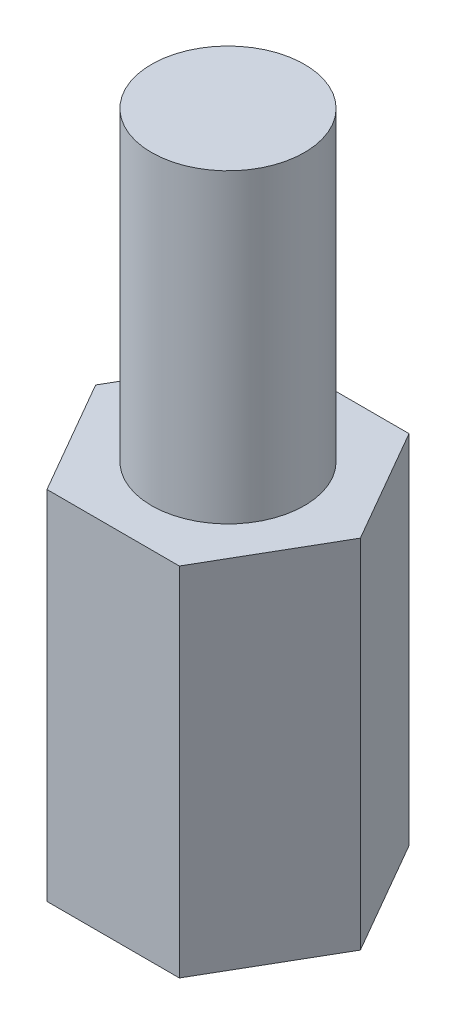
ISO-10303-21;
HEADER;
FILE_DESCRIPTION(('STEP AP214'),'2;1');
FILE_NAME('part.step','',(''),(''),'','','');
FILE_SCHEMA(('AUTOMOTIVE_DESIGN { 1 0 10303 214 1 1 1 1 }'));
ENDSEC;
DATA;
#1=APPLICATION_CONTEXT('core data for automotive mechanical design processes');
#2=APPLICATION_PROTOCOL_DEFINITION('international standard','automotive_design',2000,#1);
#3=PRODUCT_CONTEXT('',#1,'mechanical');
#4=PRODUCT('Part','Part','',(#3));
#5=PRODUCT_RELATED_PRODUCT_CATEGORY('part','',(#4));
#6=PRODUCT_DEFINITION_FORMATION('','',#4);
#7=PRODUCT_DEFINITION_CONTEXT('part definition',#1,'design');
#8=PRODUCT_DEFINITION('design','',#6,#7);
#9=PRODUCT_DEFINITION_SHAPE('','',#8);
#10=(LENGTH_UNIT() NAMED_UNIT(*) SI_UNIT(.MILLI.,.METRE.));
#11=(NAMED_UNIT(*) PLANE_ANGLE_UNIT() SI_UNIT($,.RADIAN.));
#12=(NAMED_UNIT(*) SI_UNIT($,.STERADIAN.) SOLID_ANGLE_UNIT());
#13=UNCERTAINTY_MEASURE_WITH_UNIT(LENGTH_MEASURE(1.E-05),#10,'distance_accuracy_value','');
#14=(GEOMETRIC_REPRESENTATION_CONTEXT(3) GLOBAL_UNCERTAINTY_ASSIGNED_CONTEXT((#13)) GLOBAL_UNIT_ASSIGNED_CONTEXT((#10,
#11,#12)) REPRESENTATION_CONTEXT('',''));
#15=CARTESIAN_POINT('',(0.,0.,0.));
#16=DIRECTION('',(0.,0.,1.));
#17=DIRECTION('',(1.,0.,0.));
#18=AXIS2_PLACEMENT_3D('',#15,#16,#17);
#19=CARTESIAN_POINT('',(0.,13.,0.));
#20=DIRECTION('',(0.,-1.,0.));
#21=DIRECTION('',(0.,0.,-1.));
#22=AXIS2_PLACEMENT_3D('',#19,#20,#21);
#23=CYLINDRICAL_SURFACE('',#22,1.5);
#24=CARTESIAN_POINT('',(0.,13.,0.));
#25=DIRECTION('',(0.,1.,0.));
#26=DIRECTION('',(0.,0.,1.));
#27=AXIS2_PLACEMENT_3D('',#24,#25,#26);
#28=CIRCLE('',#27,1.5);
#29=CARTESIAN_POINT('',(0.,13.,1.5));
#30=VERTEX_POINT('',#29);
#31=EDGE_CURVE('E13',#30,#30,#28,.T.);
#32=ORIENTED_EDGE('',*,*,#31,.F.);
#33=EDGE_LOOP('',(#32));
#34=FACE_BOUND('',#33,.T.);
#35=CARTESIAN_POINT('',(0.,7.,0.));
#36=DIRECTION('',(0.,1.,0.));
#37=DIRECTION('',(0.,0.,1.));
#38=AXIS2_PLACEMENT_3D('',#35,#36,#37);
#39=CIRCLE('',#38,1.5);
#40=CARTESIAN_POINT('',(0.,7.,1.5));
#41=VERTEX_POINT('',#40);
#42=EDGE_CURVE('E62',#41,#41,#39,.T.);
#43=ORIENTED_EDGE('',*,*,#42,.T.);
#44=EDGE_LOOP('',(#43));
#45=FACE_BOUND('',#44,.T.);
#46=ADVANCED_FACE('F59',(#34,#45),#23,.T.);
#47=CARTESIAN_POINT('',(0.,13.,0.));
#48=DIRECTION('',(0.,1.,0.));
#49=DIRECTION('',(0.,0.,1.));
#50=AXIS2_PLACEMENT_3D('',#47,#48,#49);
#51=PLANE('',#50);
#52=ORIENTED_EDGE('',*,*,#31,.T.);
#53=EDGE_LOOP('',(#52));
#54=FACE_BOUND('',#53,.T.);
#55=ADVANCED_FACE('F74',(#54),#51,.T.);
#56=CARTESIAN_POINT('',(0.,7.,0.));
#57=DIRECTION('',(0.,1.,0.));
#58=DIRECTION('',(0.,0.,1.));
#59=AXIS2_PLACEMENT_3D('',#56,#57,#58);
#60=PLANE('',#59);
#61=ORIENTED_EDGE('',*,*,#42,.F.);
#62=EDGE_LOOP('',(#61));
#63=FACE_BOUND('',#62,.T.);
#64=ADVANCED_FACE('F72',(#63),#60,.F.);
#65=CLOSED_SHELL('',(#46,#55,#64));
#66=MANIFOLD_SOLID_BREP('B2',#65);
#67=CARTESIAN_POINT('',(-2.59942436507711,7.,-0.00233507074599328));
#68=DIRECTION('',(0.866474205692366,0.,-0.499221845345116));
#69=DIRECTION('',(-0.499221845345116,0.,-0.866474205692366));
#70=AXIS2_PLACEMENT_3D('',#67,#68,#69);
#71=PLANE('',#70);
#72=DIRECTION('',(0.499221845345116,0.,0.866474205692366));
#73=VECTOR('',#72,1.);
#74=CARTESIAN_POINT('',(-2.59942436507711,0.,-0.00233507074599328));
#75=LINE('',#74,#73);
#76=CARTESIAN_POINT('',(-2.59942436507711,0.,-0.00233507074599328));
#77=VERTEX_POINT('',#76);
#78=CARTESIAN_POINT('',(-1.30173441312422,0.,2.25000000000002));
#79=VERTEX_POINT('',#78);
#80=EDGE_CURVE('E192',#77,#79,#75,.T.);
#81=ORIENTED_EDGE('',*,*,#80,.T.);
#82=DIRECTION('',(0.,-1.,0.));
#83=VECTOR('',#82,1.);
#84=CARTESIAN_POINT('',(-1.30173441312422,7.,2.25000000000002));
#85=LINE('',#84,#83);
#86=CARTESIAN_POINT('',(-1.30173441312422,7.,2.25000000000002));
#87=VERTEX_POINT('',#86);
#88=EDGE_CURVE('E57',#87,#79,#85,.T.);
#89=ORIENTED_EDGE('',*,*,#88,.F.);
#90=DIRECTION('',(0.499221845345116,0.,0.866474205692366));
#91=VECTOR('',#90,1.);
#92=CARTESIAN_POINT('',(-2.59942436507711,7.,-0.00233507074599328));
#93=LINE('',#92,#91);
#94=CARTESIAN_POINT('',(-2.59942436507711,7.,-0.00233507074599328));
#95=VERTEX_POINT('',#94);
#96=EDGE_CURVE('E203',#95,#87,#93,.T.);
#97=ORIENTED_EDGE('',*,*,#96,.F.);
#98=DIRECTION('',(0.,-1.,0.));
#99=VECTOR('',#98,1.);
#100=CARTESIAN_POINT('',(-2.59942436507711,7.,-0.00233507074599328));
#101=LINE('',#100,#99);
#102=EDGE_CURVE('E188',#95,#77,#101,.T.);
#103=ORIENTED_EDGE('',*,*,#102,.T.);
#104=EDGE_LOOP('',(#81,#89,#97,#103));
#105=FACE_BOUND('',#104,.T.);
#106=ADVANCED_FACE('F108',(#105),#71,.F.);
#107=CARTESIAN_POINT('',(-1.30173441312422,7.,2.25000000000002));
#108=DIRECTION('',(0.000898302653166183,0.,-0.99999959652609));
#109=DIRECTION('',(-0.99999959652609,0.,-0.000898302653166183));
#110=AXIS2_PLACEMENT_3D('',#107,#108,#109);
#111=PLANE('',#110);
#112=DIRECTION('',(0.99999959652609,0.,0.000898302653166183));
#113=VECTOR('',#112,1.);
#114=CARTESIAN_POINT('',(-1.30173441312422,0.,2.25000000000002));
#115=LINE('',#114,#113);
#116=CARTESIAN_POINT('',(1.29768995195289,0.,2.25233507074601));
#117=VERTEX_POINT('',#116);
#118=EDGE_CURVE('E195',#79,#117,#115,.T.);
#119=ORIENTED_EDGE('',*,*,#118,.T.);
#120=DIRECTION('',(0.,-1.,0.));
#121=VECTOR('',#120,1.);
#122=CARTESIAN_POINT('',(1.29768995195289,7.,2.25233507074601));
#123=LINE('',#122,#121);
#124=CARTESIAN_POINT('',(1.29768995195289,7.,2.25233507074601));
#125=VERTEX_POINT('',#124);
#126=EDGE_CURVE('E116',#125,#117,#123,.T.);
#127=ORIENTED_EDGE('',*,*,#126,.F.);
#128=DIRECTION('',(0.99999959652609,0.,0.000898302653166183));
#129=VECTOR('',#128,1.);
#130=CARTESIAN_POINT('',(-1.30173441312422,7.,2.25000000000002));
#131=LINE('',#130,#129);
#132=EDGE_CURVE('E161',#87,#125,#131,.T.);
#133=ORIENTED_EDGE('',*,*,#132,.F.);
#134=ORIENTED_EDGE('',*,*,#88,.T.);
#135=EDGE_LOOP('',(#119,#127,#133,#134));
#136=FACE_BOUND('',#135,.T.);
#137=ADVANCED_FACE('F227',(#136),#111,.F.);
#138=CARTESIAN_POINT('',(1.29768995195289,7.,2.25233507074601));
#139=DIRECTION('',(-0.8655759030392,0.,-0.500777751180974));
#140=DIRECTION('',(-0.500777751180974,0.,0.8655759030392));
#141=AXIS2_PLACEMENT_3D('',#138,#139,#140);
#142=PLANE('',#141);
#143=DIRECTION('',(0.500777751180974,0.,-0.8655759030392));
#144=VECTOR('',#143,1.);
#145=CARTESIAN_POINT('',(1.29768995195289,0.,2.25233507074601));
#146=LINE('',#145,#144);
#147=CARTESIAN_POINT('',(2.59942436507711,0.,0.00233507074599284));
#148=VERTEX_POINT('',#147);
#149=EDGE_CURVE('E198',#117,#148,#146,.T.);
#150=ORIENTED_EDGE('',*,*,#149,.T.);
#151=DIRECTION('',(0.,-1.,0.));
#152=VECTOR('',#151,1.);
#153=CARTESIAN_POINT('',(2.59942436507711,7.,0.00233507074599284));
#154=LINE('',#153,#152);
#155=CARTESIAN_POINT('',(2.59942436507711,7.,0.00233507074599284));
#156=VERTEX_POINT('',#155);
#157=EDGE_CURVE('E183',#156,#148,#154,.T.);
#158=ORIENTED_EDGE('',*,*,#157,.F.);
#159=DIRECTION('',(0.500777751180974,0.,-0.8655759030392));
#160=VECTOR('',#159,1.);
#161=CARTESIAN_POINT('',(1.29768995195289,7.,2.25233507074601));
#162=LINE('',#161,#160);
#163=EDGE_CURVE('E174',#125,#156,#162,.T.);
#164=ORIENTED_EDGE('',*,*,#163,.F.);
#165=ORIENTED_EDGE('',*,*,#126,.T.);
#166=EDGE_LOOP('',(#150,#158,#164,#165));
#167=FACE_BOUND('',#166,.T.);
#168=ADVANCED_FACE('F209',(#167),#142,.F.);
#169=CARTESIAN_POINT('',(2.59942436507711,7.,0.00233507074599284));
#170=DIRECTION('',(-0.866474205692366,0.,0.499221845345116));
#171=DIRECTION('',(0.499221845345116,0.,0.866474205692366));
#172=AXIS2_PLACEMENT_3D('',#169,#170,#171);
#173=PLANE('',#172);
#174=DIRECTION('',(-0.499221845345116,0.,-0.866474205692366));
#175=VECTOR('',#174,1.);
#176=CARTESIAN_POINT('',(2.59942436507711,0.,0.00233507074599284));
#177=LINE('',#176,#175);
#178=CARTESIAN_POINT('',(1.30173441312422,0.,-2.25000000000002));
#179=VERTEX_POINT('',#178);
#180=EDGE_CURVE('E182',#148,#179,#177,.T.);
#181=ORIENTED_EDGE('',*,*,#180,.T.);
#182=DIRECTION('',(0.,-1.,0.));
#183=VECTOR('',#182,1.);
#184=CARTESIAN_POINT('',(1.30173441312422,7.,-2.25000000000002));
#185=LINE('',#184,#183);
#186=CARTESIAN_POINT('',(1.30173441312422,7.,-2.25000000000002));
#187=VERTEX_POINT('',#186);
#188=EDGE_CURVE('E179',#187,#179,#185,.T.);
#189=ORIENTED_EDGE('',*,*,#188,.F.);
#190=DIRECTION('',(-0.499221845345116,0.,-0.866474205692366));
#191=VECTOR('',#190,1.);
#192=CARTESIAN_POINT('',(2.59942436507711,7.,0.00233507074599284));
#193=LINE('',#192,#191);
#194=EDGE_CURVE('E168',#156,#187,#193,.T.);
#195=ORIENTED_EDGE('',*,*,#194,.F.);
#196=ORIENTED_EDGE('',*,*,#157,.T.);
#197=EDGE_LOOP('',(#181,#189,#195,#196));
#198=FACE_BOUND('',#197,.T.);
#199=ADVANCED_FACE('F180',(#198),#173,.F.);
#200=CARTESIAN_POINT('',(1.30173441312422,7.,-2.25000000000002));
#201=DIRECTION('',(-0.000898302653166016,0.,0.99999959652609));
#202=DIRECTION('',(0.99999959652609,0.,0.000898302653166016));
#203=AXIS2_PLACEMENT_3D('',#200,#201,#202);
#204=PLANE('',#203);
#205=DIRECTION('',(-0.99999959652609,0.,-0.000898302653166016));
#206=VECTOR('',#205,1.);
#207=CARTESIAN_POINT('',(1.30173441312422,0.,-2.25000000000002));
#208=LINE('',#207,#206);
#209=CARTESIAN_POINT('',(-1.29768995195289,0.,-2.25233507074601));
#210=VERTEX_POINT('',#209);
#211=EDGE_CURVE('E147',#179,#210,#208,.T.);
#212=ORIENTED_EDGE('',*,*,#211,.T.);
#213=DIRECTION('',(0.,-1.,0.));
#214=VECTOR('',#213,1.);
#215=CARTESIAN_POINT('',(-1.29768995195289,7.,-2.25233507074601));
#216=LINE('',#215,#214);
#217=CARTESIAN_POINT('',(-1.29768995195289,7.,-2.25233507074601));
#218=VERTEX_POINT('',#217);
#219=EDGE_CURVE('E184',#218,#210,#216,.T.);
#220=ORIENTED_EDGE('',*,*,#219,.F.);
#221=DIRECTION('',(-0.99999959652609,0.,-0.000898302653166016));
#222=VECTOR('',#221,1.);
#223=CARTESIAN_POINT('',(1.30173441312422,7.,-2.25000000000002));
#224=LINE('',#223,#222);
#225=EDGE_CURVE('E172',#187,#218,#224,.T.);
#226=ORIENTED_EDGE('',*,*,#225,.F.);
#227=ORIENTED_EDGE('',*,*,#188,.T.);
#228=EDGE_LOOP('',(#212,#220,#226,#227));
#229=FACE_BOUND('',#228,.T.);
#230=ADVANCED_FACE('F186',(#229),#204,.F.);
#231=CARTESIAN_POINT('',(-1.29768995195289,7.,-2.25233507074601));
#232=DIRECTION('',(0.8655759030392,0.,0.500777751180974));
#233=DIRECTION('',(0.500777751180974,0.,-0.8655759030392));
#234=AXIS2_PLACEMENT_3D('',#231,#232,#233);
#235=PLANE('',#234);
#236=DIRECTION('',(-0.500777751180974,0.,0.8655759030392));
#237=VECTOR('',#236,1.);
#238=CARTESIAN_POINT('',(-1.29768995195289,0.,-2.25233507074601));
#239=LINE('',#238,#237);
#240=EDGE_CURVE('E153',#210,#77,#239,.T.);
#241=ORIENTED_EDGE('',*,*,#240,.T.);
#242=ORIENTED_EDGE('',*,*,#102,.F.);
#243=DIRECTION('',(-0.500777751180974,0.,0.8655759030392));
#244=VECTOR('',#243,1.);
#245=CARTESIAN_POINT('',(-1.29768995195289,7.,-2.25233507074601));
#246=LINE('',#245,#244);
#247=EDGE_CURVE('E124',#218,#95,#246,.T.);
#248=ORIENTED_EDGE('',*,*,#247,.F.);
#249=ORIENTED_EDGE('',*,*,#219,.T.);
#250=EDGE_LOOP('',(#241,#242,#248,#249));
#251=FACE_BOUND('',#250,.T.);
#252=ADVANCED_FACE('F216',(#251),#235,.F.);
#253=CARTESIAN_POINT('',(0.,7.,0.));
#254=DIRECTION('',(0.,1.,0.));
#255=DIRECTION('',(0.,0.,1.));
#256=AXIS2_PLACEMENT_3D('',#253,#254,#255);
#257=PLANE('',#256);
#258=ORIENTED_EDGE('',*,*,#96,.T.);
#259=ORIENTED_EDGE('',*,*,#132,.T.);
#260=ORIENTED_EDGE('',*,*,#163,.T.);
#261=ORIENTED_EDGE('',*,*,#194,.T.);
#262=ORIENTED_EDGE('',*,*,#225,.T.);
#263=ORIENTED_EDGE('',*,*,#247,.T.);
#264=EDGE_LOOP('',(#258,#259,#260,#261,#262,#263));
#265=FACE_BOUND('',#264,.T.);
#266=ADVANCED_FACE('F170',(#265),#257,.T.);
#267=CARTESIAN_POINT('',(0.,0.,0.));
#268=DIRECTION('',(0.,1.,0.));
#269=DIRECTION('',(0.,0.,1.));
#270=AXIS2_PLACEMENT_3D('',#267,#268,#269);
#271=PLANE('',#270);
#272=CARTESIAN_POINT('',(0.,0.,0.));
#273=DIRECTION('',(0.,-1.,0.));
#274=DIRECTION('',(0.,0.,-1.));
#275=AXIS2_PLACEMENT_3D('',#272,#273,#274);
#276=CIRCLE('',#275,1.25);
#277=CARTESIAN_POINT('',(0.,0.,-1.25));
#278=VERTEX_POINT('',#277);
#279=EDGE_CURVE('E293',#278,#278,#276,.T.);
#280=ORIENTED_EDGE('',*,*,#279,.F.);
#281=EDGE_LOOP('',(#280));
#282=FACE_BOUND('',#281,.T.);
#283=ORIENTED_EDGE('',*,*,#80,.F.);
#284=ORIENTED_EDGE('',*,*,#240,.F.);
#285=ORIENTED_EDGE('',*,*,#211,.F.);
#286=ORIENTED_EDGE('',*,*,#180,.F.);
#287=ORIENTED_EDGE('',*,*,#149,.F.);
#288=ORIENTED_EDGE('',*,*,#118,.F.);
#289=EDGE_LOOP('',(#283,#284,#285,#286,#287,#288));
#290=FACE_BOUND('',#289,.T.);
#291=ADVANCED_FACE('F212',(#282,#290),#271,.F.);
#292=CARTESIAN_POINT('',(0.,6.5,0.));
#293=DIRECTION('',(0.,-1.,0.));
#294=DIRECTION('',(0.,0.,-1.));
#295=AXIS2_PLACEMENT_3D('',#292,#293,#294);
#296=CYLINDRICAL_SURFACE('',#295,1.25);
#297=CARTESIAN_POINT('',(0.,6.5,0.));
#298=DIRECTION('',(0.,-1.,0.));
#299=DIRECTION('',(0.,0.,-1.));
#300=AXIS2_PLACEMENT_3D('',#297,#298,#299);
#301=CIRCLE('',#300,1.25);
#302=CARTESIAN_POINT('',(0.,6.5,-1.25));
#303=VERTEX_POINT('',#302);
#304=EDGE_CURVE('E196',#303,#303,#301,.T.);
#305=CARTESIAN_POINT('',(0.,6.5,-1.25));
#306=CARTESIAN_POINT('',(0.,6.43229166666667,-1.25));
#307=CARTESIAN_POINT('',(0.,6.36458333333333,-1.25));
#308=CARTESIAN_POINT('',(0.,6.22916666666667,-1.25));
#309=CARTESIAN_POINT('',(0.,6.16145833333333,-1.25));
#310=CARTESIAN_POINT('',(0.,6.02604166666667,-1.25));
#311=CARTESIAN_POINT('',(0.,5.95833333333333,-1.25));
#312=CARTESIAN_POINT('',(0.,5.82291666666667,-1.25));
#313=CARTESIAN_POINT('',(0.,5.75520833333333,-1.25));
#314=CARTESIAN_POINT('',(0.,5.61979166666667,-1.25));
#315=CARTESIAN_POINT('',(0.,5.55208333333333,-1.25));
#316=CARTESIAN_POINT('',(0.,5.41666666666667,-1.25));
#317=CARTESIAN_POINT('',(0.,5.34895833333333,-1.25));
#318=CARTESIAN_POINT('',(0.,5.21354166666667,-1.25));
#319=CARTESIAN_POINT('',(0.,5.14583333333333,-1.25));
#320=CARTESIAN_POINT('',(0.,5.01041666666667,-1.25));
#321=CARTESIAN_POINT('',(0.,4.94270833333333,-1.25));
#322=CARTESIAN_POINT('',(0.,4.80729166666667,-1.25));
#323=CARTESIAN_POINT('',(0.,4.73958333333333,-1.25));
#324=CARTESIAN_POINT('',(0.,4.60416666666667,-1.25));
#325=CARTESIAN_POINT('',(0.,4.53645833333333,-1.25));
#326=CARTESIAN_POINT('',(0.,4.40104166666667,-1.25));
#327=CARTESIAN_POINT('',(0.,4.33333333333333,-1.25));
#328=CARTESIAN_POINT('',(0.,4.19791666666667,-1.25));
#329=CARTESIAN_POINT('',(0.,4.13020833333333,-1.25));
#330=CARTESIAN_POINT('',(0.,3.99479166666667,-1.25));
#331=CARTESIAN_POINT('',(0.,3.92708333333333,-1.25));
#332=CARTESIAN_POINT('',(0.,3.79166666666667,-1.25));
#333=CARTESIAN_POINT('',(0.,3.72395833333333,-1.25));
#334=CARTESIAN_POINT('',(0.,3.58854166666667,-1.25));
#335=CARTESIAN_POINT('',(0.,3.52083333333333,-1.25));
#336=CARTESIAN_POINT('',(0.,3.38541666666667,-1.25));
#337=CARTESIAN_POINT('',(0.,3.31770833333333,-1.25));
#338=CARTESIAN_POINT('',(0.,3.18229166666667,-1.25));
#339=CARTESIAN_POINT('',(0.,3.11458333333333,-1.25));
#340=CARTESIAN_POINT('',(0.,2.97916666666667,-1.25));
#341=CARTESIAN_POINT('',(0.,2.91145833333333,-1.25));
#342=CARTESIAN_POINT('',(0.,2.77604166666667,-1.25));
#343=CARTESIAN_POINT('',(0.,2.70833333333333,-1.25));
#344=CARTESIAN_POINT('',(0.,2.57291666666667,-1.25));
#345=CARTESIAN_POINT('',(0.,2.50520833333333,-1.25));
#346=CARTESIAN_POINT('',(0.,2.36979166666667,-1.25));
#347=CARTESIAN_POINT('',(0.,2.30208333333333,-1.25));
#348=CARTESIAN_POINT('',(0.,2.16666666666667,-1.25));
#349=CARTESIAN_POINT('',(0.,2.09895833333333,-1.25));
#350=CARTESIAN_POINT('',(0.,1.96354166666667,-1.25));
#351=CARTESIAN_POINT('',(0.,1.89583333333333,-1.25));
#352=CARTESIAN_POINT('',(0.,1.76041666666667,-1.25));
#353=CARTESIAN_POINT('',(0.,1.69270833333333,-1.25));
#354=CARTESIAN_POINT('',(0.,1.55729166666667,-1.25));
#355=CARTESIAN_POINT('',(0.,1.48958333333333,-1.25));
#356=CARTESIAN_POINT('',(0.,1.35416666666667,-1.25));
#357=CARTESIAN_POINT('',(0.,1.28645833333333,-1.25));
#358=CARTESIAN_POINT('',(0.,1.15104166666667,-1.25));
#359=CARTESIAN_POINT('',(0.,1.08333333333333,-1.25));
#360=CARTESIAN_POINT('',(0.,0.947916666666667,-1.25));
#361=CARTESIAN_POINT('',(0.,0.880208333333333,-1.25));
#362=CARTESIAN_POINT('',(0.,0.744791666666667,-1.25));
#363=CARTESIAN_POINT('',(0.,0.677083333333333,-1.25));
#364=CARTESIAN_POINT('',(0.,0.541666666666667,-1.25));
#365=CARTESIAN_POINT('',(0.,0.473958333333333,-1.25));
#366=CARTESIAN_POINT('',(0.,0.338541666666667,-1.25));
#367=CARTESIAN_POINT('',(0.,0.270833333333334,-1.25));
#368=CARTESIAN_POINT('',(0.,0.135416666666667,-1.25));
#369=CARTESIAN_POINT('',(0.,0.0677083333333334,-1.25));
#370=CARTESIAN_POINT('',(0.,0.,-1.25));
#371=B_SPLINE_CURVE_WITH_KNOTS('',3,(#305,#306,#307,#308,#309,#310,#311,#312,#313,#314,#315,
#316,#317,#318,#319,#320,#321,#322,#323,#324,#325,#326,#327,#328,#329,#330,#331,#332,#333,#334,
#335,#336,#337,#338,#339,#340,#341,#342,#343,#344,#345,#346,#347,#348,#349,#350,#351,#352,#353,
#354,#355,#356,#357,#358,#359,#360,#361,#362,#363,#364,#365,#366,#367,#368,#369,#370),
.UNSPECIFIED.,.F.,.F.,(4,2,2,2,2,2,2,2,2,2,2,2,2,2,2,2,2,2,2,2,2,2,2,2,2,2,2,2,2,2,2,2,4),(0.,
0.203124999999999,0.40625,0.609375,0.8125,1.015625,1.21875,1.421875,1.625,1.828125,2.03125,
2.234375,2.4375,2.640625,2.84375,3.046875,3.25,3.453125,3.65625,3.859375,4.0625,4.265625,
4.46875,4.671875,4.875,5.078125,5.28125,5.484375,5.6875,5.890625,6.09375,6.296875,6.5),.UNSPECIFIED.);
#372=EDGE_CURVE('BSEAM264',#303,#278,#371,.T.);
#373=ORIENTED_EDGE('',*,*,#304,.F.);
#374=ORIENTED_EDGE('',*,*,#279,.T.);
#375=ORIENTED_EDGE('',*,*,#372,.T.);
#376=ORIENTED_EDGE('',*,*,#372,.F.);
#377=EDGE_LOOP('',(#373,#375,#374,#376));
#378=FACE_BOUND('',#377,.T.);
#379=ADVANCED_FACE('F264',(#378),#296,.F.);
#380=CARTESIAN_POINT('',(0.,6.5,0.));
#381=DIRECTION('',(0.,-1.,0.));
#382=DIRECTION('',(0.,0.,-1.));
#383=AXIS2_PLACEMENT_3D('',#380,#381,#382);
#384=PLANE('',#383);
#385=ORIENTED_EDGE('',*,*,#304,.T.);
#386=EDGE_LOOP('',(#385));
#387=FACE_BOUND('',#386,.T.);
#388=ADVANCED_FACE('F274',(#387),#384,.T.);
#389=CLOSED_SHELL('',(#106,#137,#168,#199,#230,#252,#266,#291,#379,#388));
#390=MANIFOLD_SOLID_BREP('B8',#389);
#391=ADVANCED_BREP_SHAPE_REPRESENTATION('',(#18,#66,#390),#14);
#392=SHAPE_DEFINITION_REPRESENTATION(#9,#391);
ENDSEC;
END-ISO-10303-21;
